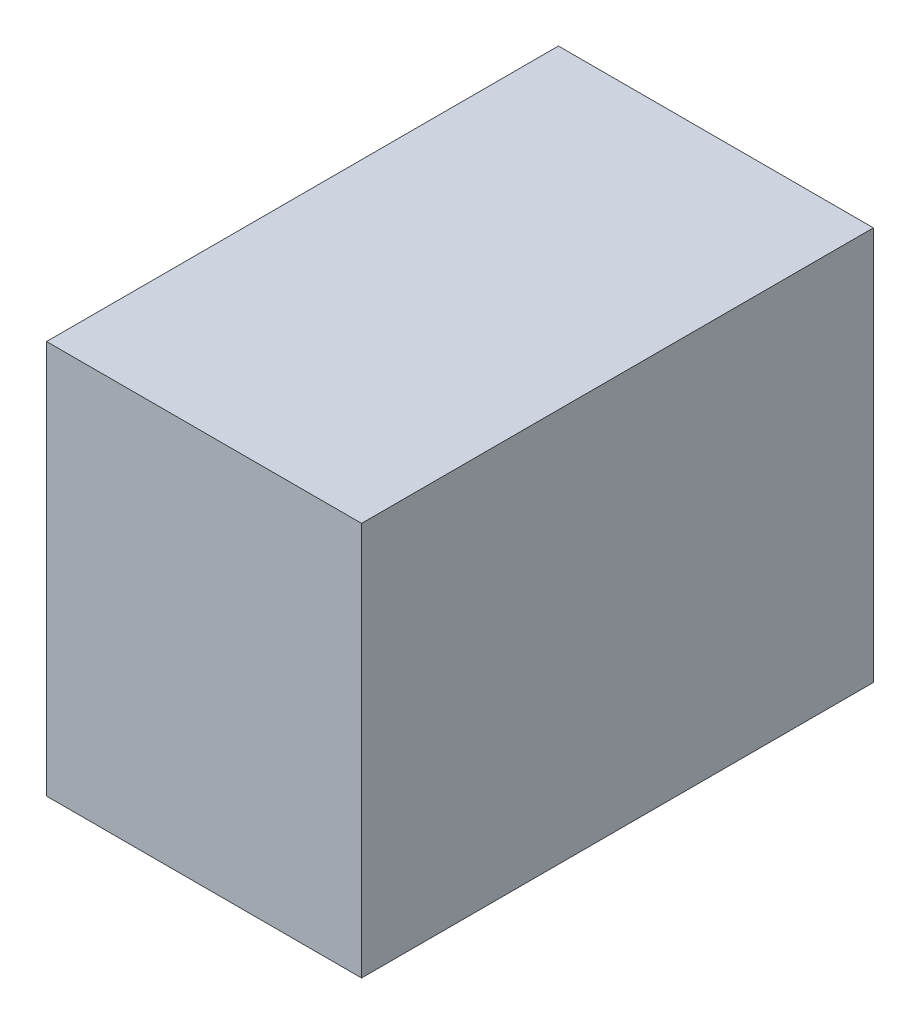
ISO-10303-21;
HEADER;
FILE_DESCRIPTION(('STEP AP214'),'2;1');
FILE_NAME('part.step','',(''),(''),'','','');
FILE_SCHEMA(('AUTOMOTIVE_DESIGN { 1 0 10303 214 1 1 1 1 }'));
ENDSEC;
DATA;
#1=APPLICATION_CONTEXT('core data for automotive mechanical design processes');
#2=APPLICATION_PROTOCOL_DEFINITION('international standard','automotive_design',2000,#1);
#3=PRODUCT_CONTEXT('',#1,'mechanical');
#4=PRODUCT('Part','Part','',(#3));
#5=PRODUCT_RELATED_PRODUCT_CATEGORY('part','',(#4));
#6=PRODUCT_DEFINITION_FORMATION('','',#4);
#7=PRODUCT_DEFINITION_CONTEXT('part definition',#1,'design');
#8=PRODUCT_DEFINITION('design','',#6,#7);
#9=PRODUCT_DEFINITION_SHAPE('','',#8);
#10=(LENGTH_UNIT() NAMED_UNIT(*) SI_UNIT(.MILLI.,.METRE.));
#11=(NAMED_UNIT(*) PLANE_ANGLE_UNIT() SI_UNIT($,.RADIAN.));
#12=(NAMED_UNIT(*) SI_UNIT($,.STERADIAN.) SOLID_ANGLE_UNIT());
#13=UNCERTAINTY_MEASURE_WITH_UNIT(LENGTH_MEASURE(1.E-05),#10,'distance_accuracy_value','');
#14=(GEOMETRIC_REPRESENTATION_CONTEXT(3) GLOBAL_UNCERTAINTY_ASSIGNED_CONTEXT((#13)) GLOBAL_UNIT_ASSIGNED_CONTEXT((#10,
#11,#12)) REPRESENTATION_CONTEXT('',''));
#15=CARTESIAN_POINT('',(0.,0.,0.));
#16=DIRECTION('',(0.,0.,1.));
#17=DIRECTION('',(1.,0.,0.));
#18=AXIS2_PLACEMENT_3D('',#15,#16,#17);
#19=CARTESIAN_POINT('',(0.,100.,130.));
#20=DIRECTION('',(1.,0.,0.));
#21=DIRECTION('',(0.,0.,-1.));
#22=AXIS2_PLACEMENT_3D('',#19,#20,#21);
#23=PLANE('',#22);
#24=DIRECTION('',(0.,-1.,0.));
#25=VECTOR('',#24,1.);
#26=CARTESIAN_POINT('',(0.,100.,0.));
#27=LINE('',#26,#25);
#28=CARTESIAN_POINT('',(0.,100.,0.));
#29=VERTEX_POINT('',#28);
#30=CARTESIAN_POINT('',(0.,0.,0.));
#31=VERTEX_POINT('',#30);
#32=EDGE_CURVE('E104',#29,#31,#27,.T.);
#33=ORIENTED_EDGE('',*,*,#32,.T.);
#34=DIRECTION('',(0.,0.,-1.));
#35=VECTOR('',#34,1.);
#36=CARTESIAN_POINT('',(0.,0.,130.));
#37=LINE('',#36,#35);
#38=CARTESIAN_POINT('',(0.,0.,130.));
#39=VERTEX_POINT('',#38);
#40=EDGE_CURVE('E11',#39,#31,#37,.T.);
#41=ORIENTED_EDGE('',*,*,#40,.F.);
#42=DIRECTION('',(0.,-1.,0.));
#43=VECTOR('',#42,1.);
#44=CARTESIAN_POINT('',(0.,100.,130.));
#45=LINE('',#44,#43);
#46=CARTESIAN_POINT('',(0.,100.,130.));
#47=VERTEX_POINT('',#46);
#48=EDGE_CURVE('E92',#47,#39,#45,.T.);
#49=ORIENTED_EDGE('',*,*,#48,.F.);
#50=DIRECTION('',(0.,0.,-1.));
#51=VECTOR('',#50,1.);
#52=CARTESIAN_POINT('',(0.,100.,130.));
#53=LINE('',#52,#51);
#54=EDGE_CURVE('E100',#47,#29,#53,.T.);
#55=ORIENTED_EDGE('',*,*,#54,.T.);
#56=EDGE_LOOP('',(#33,#41,#49,#55));
#57=FACE_BOUND('',#56,.T.);
#58=ADVANCED_FACE('F41',(#57),#23,.F.);
#59=CARTESIAN_POINT('',(0.,0.,130.));
#60=DIRECTION('',(0.,1.,0.));
#61=DIRECTION('',(0.,0.,1.));
#62=AXIS2_PLACEMENT_3D('',#59,#60,#61);
#63=PLANE('',#62);
#64=DIRECTION('',(1.,0.,0.));
#65=VECTOR('',#64,1.);
#66=CARTESIAN_POINT('',(0.,0.,0.));
#67=LINE('',#66,#65);
#68=CARTESIAN_POINT('',(80.,0.,0.));
#69=VERTEX_POINT('',#68);
#70=EDGE_CURVE('E96',#31,#69,#67,.T.);
#71=ORIENTED_EDGE('',*,*,#70,.T.);
#72=DIRECTION('',(0.,0.,-1.));
#73=VECTOR('',#72,1.);
#74=CARTESIAN_POINT('',(80.,0.,130.));
#75=LINE('',#74,#73);
#76=CARTESIAN_POINT('',(80.,0.,130.));
#77=VERTEX_POINT('',#76);
#78=EDGE_CURVE('E49',#77,#69,#75,.T.);
#79=ORIENTED_EDGE('',*,*,#78,.F.);
#80=DIRECTION('',(1.,0.,0.));
#81=VECTOR('',#80,1.);
#82=CARTESIAN_POINT('',(0.,0.,130.));
#83=LINE('',#82,#81);
#84=EDGE_CURVE('E87',#39,#77,#83,.T.);
#85=ORIENTED_EDGE('',*,*,#84,.F.);
#86=ORIENTED_EDGE('',*,*,#40,.T.);
#87=EDGE_LOOP('',(#71,#79,#85,#86));
#88=FACE_BOUND('',#87,.T.);
#89=ADVANCED_FACE('F95',(#88),#63,.F.);
#90=CARTESIAN_POINT('',(80.,0.,130.));
#91=DIRECTION('',(-1.,0.,0.));
#92=DIRECTION('',(0.,0.,1.));
#93=AXIS2_PLACEMENT_3D('',#90,#91,#92);
#94=PLANE('',#93);
#95=DIRECTION('',(0.,1.,0.));
#96=VECTOR('',#95,1.);
#97=CARTESIAN_POINT('',(80.,0.,0.));
#98=LINE('',#97,#96);
#99=CARTESIAN_POINT('',(80.,100.,0.));
#100=VERTEX_POINT('',#99);
#101=EDGE_CURVE('E74',#69,#100,#98,.T.);
#102=ORIENTED_EDGE('',*,*,#101,.T.);
#103=DIRECTION('',(0.,0.,-1.));
#104=VECTOR('',#103,1.);
#105=CARTESIAN_POINT('',(80.,100.,130.));
#106=LINE('',#105,#104);
#107=CARTESIAN_POINT('',(80.,100.,130.));
#108=VERTEX_POINT('',#107);
#109=EDGE_CURVE('E97',#108,#100,#106,.T.);
#110=ORIENTED_EDGE('',*,*,#109,.F.);
#111=DIRECTION('',(0.,1.,0.));
#112=VECTOR('',#111,1.);
#113=CARTESIAN_POINT('',(80.,0.,130.));
#114=LINE('',#113,#112);
#115=EDGE_CURVE('E90',#77,#108,#114,.T.);
#116=ORIENTED_EDGE('',*,*,#115,.F.);
#117=ORIENTED_EDGE('',*,*,#78,.T.);
#118=EDGE_LOOP('',(#102,#110,#116,#117));
#119=FACE_BOUND('',#118,.T.);
#120=ADVANCED_FACE('F98',(#119),#94,.F.);
#121=CARTESIAN_POINT('',(80.,100.,130.));
#122=DIRECTION('',(0.,-1.,0.));
#123=DIRECTION('',(0.,0.,-1.));
#124=AXIS2_PLACEMENT_3D('',#121,#122,#123);
#125=PLANE('',#124);
#126=DIRECTION('',(-1.,0.,0.));
#127=VECTOR('',#126,1.);
#128=CARTESIAN_POINT('',(80.,100.,0.));
#129=LINE('',#128,#127);
#130=EDGE_CURVE('E80',#100,#29,#129,.T.);
#131=ORIENTED_EDGE('',*,*,#130,.T.);
#132=ORIENTED_EDGE('',*,*,#54,.F.);
#133=DIRECTION('',(-1.,0.,0.));
#134=VECTOR('',#133,1.);
#135=CARTESIAN_POINT('',(80.,100.,130.));
#136=LINE('',#135,#134);
#137=EDGE_CURVE('E57',#108,#47,#136,.T.);
#138=ORIENTED_EDGE('',*,*,#137,.F.);
#139=ORIENTED_EDGE('',*,*,#109,.T.);
#140=EDGE_LOOP('',(#131,#132,#138,#139));
#141=FACE_BOUND('',#140,.T.);
#142=ADVANCED_FACE('F111',(#141),#125,.F.);
#143=CARTESIAN_POINT('',(0.,0.,130.));
#144=DIRECTION('',(0.,0.,1.));
#145=DIRECTION('',(1.,0.,0.));
#146=AXIS2_PLACEMENT_3D('',#143,#144,#145);
#147=PLANE('',#146);
#148=ORIENTED_EDGE('',*,*,#48,.T.);
#149=ORIENTED_EDGE('',*,*,#84,.T.);
#150=ORIENTED_EDGE('',*,*,#115,.T.);
#151=ORIENTED_EDGE('',*,*,#137,.T.);
#152=EDGE_LOOP('',(#148,#149,#150,#151));
#153=FACE_BOUND('',#152,.T.);
#154=ADVANCED_FACE('F88',(#153),#147,.T.);
#155=CARTESIAN_POINT('',(0.,0.,0.));
#156=DIRECTION('',(0.,0.,1.));
#157=DIRECTION('',(1.,0.,0.));
#158=AXIS2_PLACEMENT_3D('',#155,#156,#157);
#159=PLANE('',#158);
#160=ORIENTED_EDGE('',*,*,#32,.F.);
#161=ORIENTED_EDGE('',*,*,#130,.F.);
#162=ORIENTED_EDGE('',*,*,#101,.F.);
#163=ORIENTED_EDGE('',*,*,#70,.F.);
#164=EDGE_LOOP('',(#160,#161,#162,#163));
#165=FACE_BOUND('',#164,.T.);
#166=ADVANCED_FACE('F114',(#165),#159,.F.);
#167=CLOSED_SHELL('',(#58,#89,#120,#142,#154,#166));
#168=MANIFOLD_SOLID_BREP('B2',#167);
#169=ADVANCED_BREP_SHAPE_REPRESENTATION('',(#18,#168),#14);
#170=SHAPE_DEFINITION_REPRESENTATION(#9,#169);
ENDSEC;
END-ISO-10303-21;
